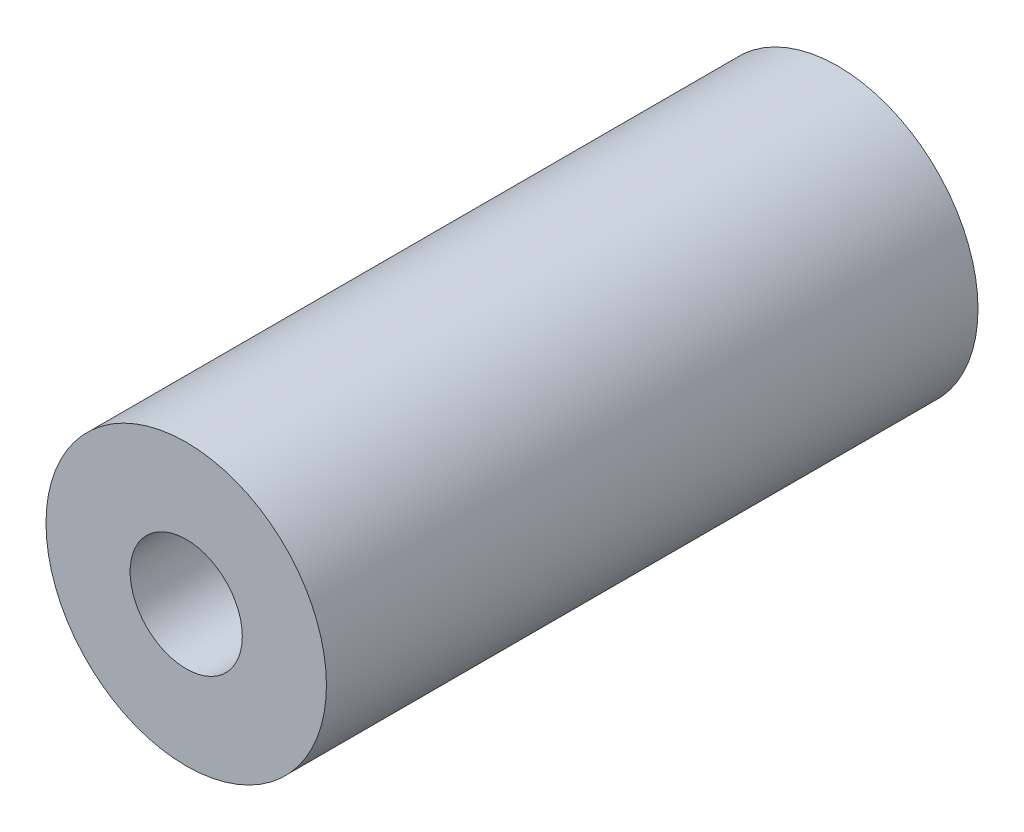
ISO-10303-21;
HEADER;
FILE_DESCRIPTION(('STEP AP214'),'2;1');
FILE_NAME('part.step','',(''),(''),'','','');
FILE_SCHEMA(('AUTOMOTIVE_DESIGN { 1 0 10303 214 1 1 1 1 }'));
ENDSEC;
DATA;
#1=APPLICATION_CONTEXT('core data for automotive mechanical design processes');
#2=APPLICATION_PROTOCOL_DEFINITION('international standard','automotive_design',2000,#1);
#3=PRODUCT_CONTEXT('',#1,'mechanical');
#4=PRODUCT('Part','Part','',(#3));
#5=PRODUCT_RELATED_PRODUCT_CATEGORY('part','',(#4));
#6=PRODUCT_DEFINITION_FORMATION('','',#4);
#7=PRODUCT_DEFINITION_CONTEXT('part definition',#1,'design');
#8=PRODUCT_DEFINITION('design','',#6,#7);
#9=PRODUCT_DEFINITION_SHAPE('','',#8);
#10=(LENGTH_UNIT() NAMED_UNIT(*) SI_UNIT(.MILLI.,.METRE.));
#11=(NAMED_UNIT(*) PLANE_ANGLE_UNIT() SI_UNIT($,.RADIAN.));
#12=(NAMED_UNIT(*) SI_UNIT($,.STERADIAN.) SOLID_ANGLE_UNIT());
#13=UNCERTAINTY_MEASURE_WITH_UNIT(LENGTH_MEASURE(1.E-05),#10,'distance_accuracy_value','');
#14=(GEOMETRIC_REPRESENTATION_CONTEXT(3) GLOBAL_UNCERTAINTY_ASSIGNED_CONTEXT((#13)) GLOBAL_UNIT_ASSIGNED_CONTEXT((#10,
#11,#12)) REPRESENTATION_CONTEXT('',''));
#15=CARTESIAN_POINT('',(0.,0.,0.));
#16=DIRECTION('',(0.,0.,1.));
#17=DIRECTION('',(1.,0.,0.));
#18=AXIS2_PLACEMENT_3D('',#15,#16,#17);
#19=CARTESIAN_POINT('',(0.,0.,19.75));
#20=DIRECTION('',(0.,0.,1.));
#21=DIRECTION('',(1.,0.,0.));
#22=AXIS2_PLACEMENT_3D('',#19,#20,#21);
#23=PLANE('',#22);
#24=CARTESIAN_POINT('',(0.,0.,19.75));
#25=DIRECTION('',(0.,0.,1.));
#26=DIRECTION('',(1.,0.,0.));
#27=AXIS2_PLACEMENT_3D('',#24,#25,#26);
#28=CIRCLE('',#27,4.25);
#29=CARTESIAN_POINT('',(4.25,0.,19.75));
#30=VERTEX_POINT('',#29);
#31=EDGE_CURVE('E10',#30,#30,#28,.T.);
#32=ORIENTED_EDGE('',*,*,#31,.T.);
#33=EDGE_LOOP('',(#32));
#34=FACE_BOUND('',#33,.T.);
#35=CARTESIAN_POINT('',(0.,0.,19.75));
#36=DIRECTION('',(0.,0.,1.));
#37=DIRECTION('',(1.,0.,0.));
#38=AXIS2_PLACEMENT_3D('',#35,#36,#37);
#39=CIRCLE('',#38,1.7);
#40=CARTESIAN_POINT('',(1.7,0.,19.75));
#41=VERTEX_POINT('',#40);
#42=EDGE_CURVE('E42',#41,#41,#39,.T.);
#43=ORIENTED_EDGE('',*,*,#42,.F.);
#44=EDGE_LOOP('',(#43));
#45=FACE_BOUND('',#44,.T.);
#46=ADVANCED_FACE('F31',(#34,#45),#23,.T.);
#47=CARTESIAN_POINT('',(0.,0.,0.));
#48=DIRECTION('',(0.,0.,1.));
#49=DIRECTION('',(1.,0.,0.));
#50=AXIS2_PLACEMENT_3D('',#47,#48,#49);
#51=PLANE('',#50);
#52=CARTESIAN_POINT('',(0.,0.,0.));
#53=DIRECTION('',(0.,0.,1.));
#54=DIRECTION('',(1.,0.,0.));
#55=AXIS2_PLACEMENT_3D('',#52,#53,#54);
#56=CIRCLE('',#55,4.25);
#57=CARTESIAN_POINT('',(4.25,0.,0.));
#58=VERTEX_POINT('',#57);
#59=EDGE_CURVE('E35',#58,#58,#56,.T.);
#60=ORIENTED_EDGE('',*,*,#59,.F.);
#61=EDGE_LOOP('',(#60));
#62=FACE_BOUND('',#61,.T.);
#63=CARTESIAN_POINT('',(0.,0.,0.));
#64=DIRECTION('',(0.,0.,1.));
#65=DIRECTION('',(1.,0.,0.));
#66=AXIS2_PLACEMENT_3D('',#63,#64,#65);
#67=CIRCLE('',#66,1.7);
#68=CARTESIAN_POINT('',(1.7,0.,0.));
#69=VERTEX_POINT('',#68);
#70=EDGE_CURVE('E44',#69,#69,#67,.T.);
#71=ORIENTED_EDGE('',*,*,#70,.T.);
#72=EDGE_LOOP('',(#71));
#73=FACE_BOUND('',#72,.T.);
#74=ADVANCED_FACE('F54',(#62,#73),#51,.F.);
#75=CARTESIAN_POINT('',(0.,0.,19.75));
#76=DIRECTION('',(0.,0.,-1.));
#77=DIRECTION('',(-1.,0.,0.));
#78=AXIS2_PLACEMENT_3D('',#75,#76,#77);
#79=CYLINDRICAL_SURFACE('',#78,4.25);
#80=ORIENTED_EDGE('',*,*,#31,.F.);
#81=EDGE_LOOP('',(#80));
#82=FACE_BOUND('',#81,.T.);
#83=ORIENTED_EDGE('',*,*,#59,.T.);
#84=EDGE_LOOP('',(#83));
#85=FACE_BOUND('',#84,.T.);
#86=ADVANCED_FACE('F33',(#82,#85),#79,.T.);
#87=CARTESIAN_POINT('',(0.,0.,19.75));
#88=DIRECTION('',(0.,0.,-1.));
#89=DIRECTION('',(-1.,0.,0.));
#90=AXIS2_PLACEMENT_3D('',#87,#88,#89);
#91=CYLINDRICAL_SURFACE('',#90,1.7);
#92=ORIENTED_EDGE('',*,*,#42,.T.);
#93=EDGE_LOOP('',(#92));
#94=FACE_BOUND('',#93,.T.);
#95=ORIENTED_EDGE('',*,*,#70,.F.);
#96=EDGE_LOOP('',(#95));
#97=FACE_BOUND('',#96,.T.);
#98=ADVANCED_FACE('F50',(#94,#97),#91,.F.);
#99=CLOSED_SHELL('',(#46,#74,#86,#98));
#100=MANIFOLD_SOLID_BREP('B2',#99);
#101=ADVANCED_BREP_SHAPE_REPRESENTATION('',(#18,#100),#14);
#102=SHAPE_DEFINITION_REPRESENTATION(#9,#101);
ENDSEC;
END-ISO-10303-21;
